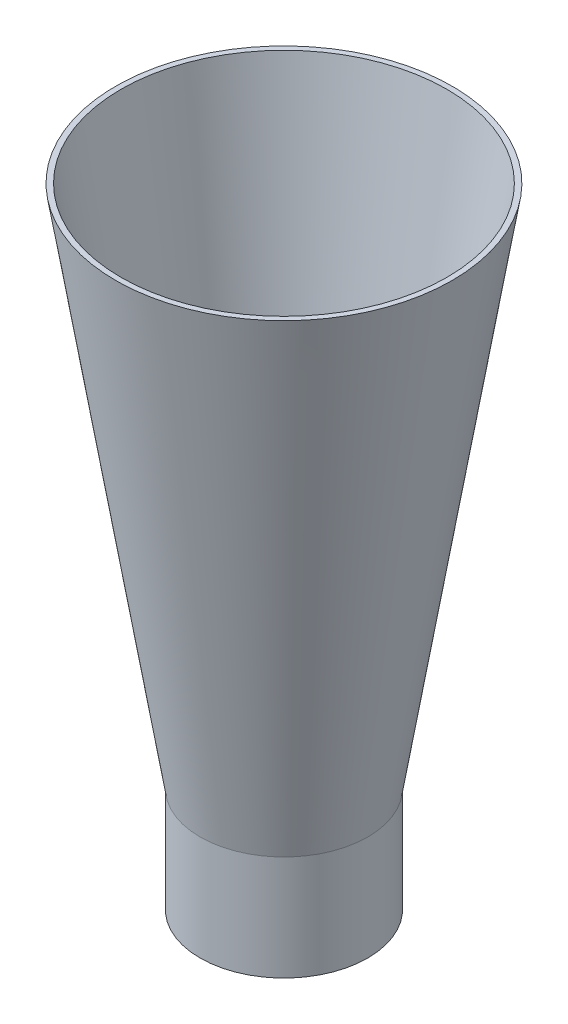
ISO-10303-21;
HEADER;
FILE_DESCRIPTION(('STEP AP214'),'2;1');
FILE_NAME('part.step','',(''),(''),'','','');
FILE_SCHEMA(('AUTOMOTIVE_DESIGN { 1 0 10303 214 1 1 1 1 }'));
ENDSEC;
DATA;
#1=APPLICATION_CONTEXT('core data for automotive mechanical design processes');
#2=APPLICATION_PROTOCOL_DEFINITION('international standard','automotive_design',2000,#1);
#3=PRODUCT_CONTEXT('',#1,'mechanical');
#4=PRODUCT('Part','Part','',(#3));
#5=PRODUCT_RELATED_PRODUCT_CATEGORY('part','',(#4));
#6=PRODUCT_DEFINITION_FORMATION('','',#4);
#7=PRODUCT_DEFINITION_CONTEXT('part definition',#1,'design');
#8=PRODUCT_DEFINITION('design','',#6,#7);
#9=PRODUCT_DEFINITION_SHAPE('','',#8);
#10=(LENGTH_UNIT() NAMED_UNIT(*) SI_UNIT(.MILLI.,.METRE.));
#11=(NAMED_UNIT(*) PLANE_ANGLE_UNIT() SI_UNIT($,.RADIAN.));
#12=(NAMED_UNIT(*) SI_UNIT($,.STERADIAN.) SOLID_ANGLE_UNIT());
#13=UNCERTAINTY_MEASURE_WITH_UNIT(LENGTH_MEASURE(1.E-05),#10,'distance_accuracy_value','');
#14=(GEOMETRIC_REPRESENTATION_CONTEXT(3) GLOBAL_UNCERTAINTY_ASSIGNED_CONTEXT((#13)) GLOBAL_UNIT_ASSIGNED_CONTEXT((#10,
#11,#12)) REPRESENTATION_CONTEXT('',''));
#15=CARTESIAN_POINT('',(0.,0.,0.));
#16=DIRECTION('',(0.,0.,1.));
#17=DIRECTION('',(1.,0.,0.));
#18=AXIS2_PLACEMENT_3D('',#15,#16,#17);
#19=CARTESIAN_POINT('',(0.,0.,0.));
#20=DIRECTION('',(0.,1.,0.));
#21=DIRECTION('',(-1.,0.,0.));
#22=AXIS2_PLACEMENT_3D('',#19,#20,#21);
#23=PLANE('',#22);
#24=CARTESIAN_POINT('',(0.,0.,0.));
#25=DIRECTION('',(0.,1.,0.));
#26=DIRECTION('',(-1.,0.,0.));
#27=AXIS2_PLACEMENT_3D('',#24,#25,#26);
#28=CIRCLE('',#27,31.0871224160838);
#29=CARTESIAN_POINT('',(-31.0871224160838,0.,0.));
#30=VERTEX_POINT('',#29);
#31=EDGE_CURVE('E54',#30,#30,#28,.F.);
#32=ORIENTED_EDGE('',*,*,#31,.T.);
#33=EDGE_LOOP('',(#32));
#34=FACE_BOUND('',#33,.T.);
#35=CARTESIAN_POINT('',(0.,0.,0.));
#36=DIRECTION('',(0.,-1.,0.));
#37=DIRECTION('',(1.,0.,0.));
#38=AXIS2_PLACEMENT_3D('',#35,#36,#37);
#39=CIRCLE('',#38,32.1);
#40=CARTESIAN_POINT('',(32.1,0.,0.));
#41=VERTEX_POINT('',#40);
#42=EDGE_CURVE('E10',#41,#41,#39,.T.);
#43=ORIENTED_EDGE('',*,*,#42,.F.);
#44=EDGE_LOOP('',(#43));
#45=FACE_BOUND('',#44,.T.);
#46=ADVANCED_FACE('F37',(#34,#45),#23,.T.);
#47=CARTESIAN_POINT('',(0.,-100.,0.));
#48=DIRECTION('',(0.,1.,0.));
#49=DIRECTION('',(-1.,0.,0.));
#50=AXIS2_PLACEMENT_3D('',#47,#48,#49);
#51=CONICAL_SURFACE('',#50,16.,0.159630148790674);
#52=ORIENTED_EDGE('',*,*,#42,.T.);
#53=EDGE_LOOP('',(#52));
#54=FACE_BOUND('',#53,.T.);
#55=CARTESIAN_POINT('',(0.,-100.,0.));
#56=DIRECTION('',(0.,-1.,0.));
#57=DIRECTION('',(1.,0.,0.));
#58=AXIS2_PLACEMENT_3D('',#55,#56,#57);
#59=CIRCLE('',#58,16.);
#60=CARTESIAN_POINT('',(16.,-100.,0.));
#61=VERTEX_POINT('',#60);
#62=EDGE_CURVE('E44',#61,#61,#59,.T.);
#63=ORIENTED_EDGE('',*,*,#62,.F.);
#64=EDGE_LOOP('',(#63));
#65=FACE_BOUND('',#64,.T.);
#66=ADVANCED_FACE('F85',(#54,#65),#51,.T.);
#67=CARTESIAN_POINT('',(0.,-120.,0.));
#68=DIRECTION('',(0.,-1.,0.));
#69=DIRECTION('',(1.,0.,0.));
#70=AXIS2_PLACEMENT_3D('',#67,#68,#69);
#71=CYLINDRICAL_SURFACE('',#70,16.);
#72=ORIENTED_EDGE('',*,*,#62,.T.);
#73=EDGE_LOOP('',(#72));
#74=FACE_BOUND('',#73,.T.);
#75=CARTESIAN_POINT('',(0.,-120.,0.));
#76=DIRECTION('',(0.,-1.,0.));
#77=DIRECTION('',(1.,0.,0.));
#78=AXIS2_PLACEMENT_3D('',#75,#76,#77);
#79=CIRCLE('',#78,16.);
#80=CARTESIAN_POINT('',(16.,-120.,0.));
#81=VERTEX_POINT('',#80);
#82=EDGE_CURVE('E49',#81,#81,#79,.T.);
#83=ORIENTED_EDGE('',*,*,#82,.F.);
#84=EDGE_LOOP('',(#83));
#85=FACE_BOUND('',#84,.T.);
#86=ADVANCED_FACE('F80',(#74,#85),#71,.T.);
#87=CARTESIAN_POINT('',(16.,-120.,0.));
#88=DIRECTION('',(0.,-1.,0.));
#89=DIRECTION('',(1.,0.,0.));
#90=AXIS2_PLACEMENT_3D('',#87,#88,#89);
#91=PLANE('',#90);
#92=CARTESIAN_POINT('',(0.,-120.,0.));
#93=DIRECTION('',(0.,-1.,0.));
#94=DIRECTION('',(1.,0.,0.));
#95=AXIS2_PLACEMENT_3D('',#92,#93,#94);
#96=CIRCLE('',#95,15.);
#97=CARTESIAN_POINT('',(15.,-120.,0.));
#98=VERTEX_POINT('',#97);
#99=EDGE_CURVE('E57',#98,#98,#96,.T.);
#100=ORIENTED_EDGE('',*,*,#99,.F.);
#101=EDGE_LOOP('',(#100));
#102=FACE_BOUND('',#101,.T.);
#103=ORIENTED_EDGE('',*,*,#82,.T.);
#104=EDGE_LOOP('',(#103));
#105=FACE_BOUND('',#104,.T.);
#106=ADVANCED_FACE('F77',(#102,#105),#91,.T.);
#107=CARTESIAN_POINT('',(0.,-99.8410469314786,0.));
#108=DIRECTION('',(0.,1.,0.));
#109=DIRECTION('',(-1.,0.,0.));
#110=AXIS2_PLACEMENT_3D('',#107,#108,#109);
#111=CONICAL_SURFACE('',#110,15.0127138601157,0.159630148790674);
#112=ORIENTED_EDGE('',*,*,#31,.F.);
#113=EDGE_LOOP('',(#112));
#114=FACE_BOUND('',#113,.T.);
#115=CARTESIAN_POINT('',(0.,-99.9200150067314,0.));
#116=DIRECTION('',(0.,1.,0.));
#117=DIRECTION('',(-1.,0.,0.));
#118=AXIS2_PLACEMENT_3D('',#115,#116,#117);
#119=CIRCLE('',#118,15.);
#120=CARTESIAN_POINT('',(-15.,-99.9200150067314,0.));
#121=VERTEX_POINT('',#120);
#122=EDGE_CURVE('E61',#121,#121,#119,.F.);
#123=ORIENTED_EDGE('',*,*,#122,.T.);
#124=EDGE_LOOP('',(#123));
#125=FACE_BOUND('',#124,.T.);
#126=ADVANCED_FACE('F69',(#114,#125),#111,.F.);
#127=CARTESIAN_POINT('',(0.,-120.,0.));
#128=DIRECTION('',(0.,-1.,0.));
#129=DIRECTION('',(1.,0.,0.));
#130=AXIS2_PLACEMENT_3D('',#127,#128,#129);
#131=CYLINDRICAL_SURFACE('',#130,15.);
#132=ORIENTED_EDGE('',*,*,#122,.F.);
#133=EDGE_LOOP('',(#132));
#134=FACE_BOUND('',#133,.T.);
#135=ORIENTED_EDGE('',*,*,#99,.T.);
#136=EDGE_LOOP('',(#135));
#137=FACE_BOUND('',#136,.T.);
#138=ADVANCED_FACE('F71',(#134,#137),#131,.F.);
#139=CLOSED_SHELL('',(#46,#66,#86,#106,#126,#138));
#140=MANIFOLD_SOLID_BREP('B2',#139);
#141=ADVANCED_BREP_SHAPE_REPRESENTATION('',(#18,#140),#14);
#142=SHAPE_DEFINITION_REPRESENTATION(#9,#141);
ENDSEC;
END-ISO-10303-21;
